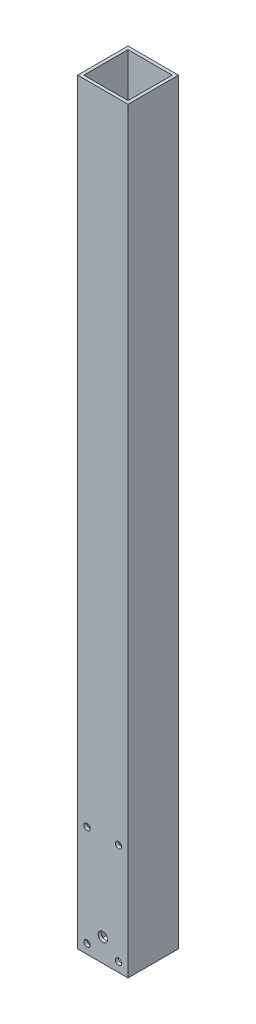
ISO-10303-21;
HEADER;
FILE_DESCRIPTION(('STEP AP214'),'2;1');
FILE_NAME('part.step','',(''),(''),'','','');
FILE_SCHEMA(('AUTOMOTIVE_DESIGN { 1 0 10303 214 1 1 1 1 }'));
ENDSEC;
DATA;
#1=APPLICATION_CONTEXT('core data for automotive mechanical design processes');
#2=APPLICATION_PROTOCOL_DEFINITION('international standard','automotive_design',2000,#1);
#3=PRODUCT_CONTEXT('',#1,'mechanical');
#4=PRODUCT('Part','Part','',(#3));
#5=PRODUCT_RELATED_PRODUCT_CATEGORY('part','',(#4));
#6=PRODUCT_DEFINITION_FORMATION('','',#4);
#7=PRODUCT_DEFINITION_CONTEXT('part definition',#1,'design');
#8=PRODUCT_DEFINITION('design','',#6,#7);
#9=PRODUCT_DEFINITION_SHAPE('','',#8);
#10=(LENGTH_UNIT() NAMED_UNIT(*) SI_UNIT(.MILLI.,.METRE.));
#11=(NAMED_UNIT(*) PLANE_ANGLE_UNIT() SI_UNIT($,.RADIAN.));
#12=(NAMED_UNIT(*) SI_UNIT($,.STERADIAN.) SOLID_ANGLE_UNIT());
#13=UNCERTAINTY_MEASURE_WITH_UNIT(LENGTH_MEASURE(1.E-05),#10,'distance_accuracy_value','');
#14=(GEOMETRIC_REPRESENTATION_CONTEXT(3) GLOBAL_UNCERTAINTY_ASSIGNED_CONTEXT((#13)) GLOBAL_UNIT_ASSIGNED_CONTEXT((#10,
#11,#12)) REPRESENTATION_CONTEXT('',''));
#15=CARTESIAN_POINT('',(0.,0.,0.));
#16=DIRECTION('',(0.,0.,1.));
#17=DIRECTION('',(1.,0.,0.));
#18=AXIS2_PLACEMENT_3D('',#15,#16,#17);
#19=CARTESIAN_POINT('',(0.,762.,0.));
#20=DIRECTION('',(0.,-1.,0.));
#21=DIRECTION('',(0.,0.,-1.));
#22=AXIS2_PLACEMENT_3D('',#19,#20,#21);
#23=PLANE('',#22);
#24=DIRECTION('',(0.,0.,1.));
#25=VECTOR('',#24,1.);
#26=CARTESIAN_POINT('',(0.,762.,0.));
#27=LINE('',#26,#25);
#28=CARTESIAN_POINT('',(0.,762.,-50.8));
#29=VERTEX_POINT('',#28);
#30=CARTESIAN_POINT('',(0.,762.,0.));
#31=VERTEX_POINT('',#30);
#32=EDGE_CURVE('E139',#29,#31,#27,.T.);
#33=ORIENTED_EDGE('',*,*,#32,.T.);
#34=DIRECTION('',(1.,0.,0.));
#35=VECTOR('',#34,1.);
#36=CARTESIAN_POINT('',(0.,762.,0.));
#37=LINE('',#36,#35);
#38=CARTESIAN_POINT('',(50.8,762.,0.));
#39=VERTEX_POINT('',#38);
#40=EDGE_CURVE('E142',#31,#39,#37,.T.);
#41=ORIENTED_EDGE('',*,*,#40,.T.);
#42=DIRECTION('',(0.,0.,-1.));
#43=VECTOR('',#42,1.);
#44=CARTESIAN_POINT('',(50.8,762.,0.));
#45=LINE('',#44,#43);
#46=CARTESIAN_POINT('',(50.8,762.,-50.8));
#47=VERTEX_POINT('',#46);
#48=EDGE_CURVE('E145',#39,#47,#45,.T.);
#49=ORIENTED_EDGE('',*,*,#48,.T.);
#50=DIRECTION('',(-1.,0.,0.));
#51=VECTOR('',#50,1.);
#52=CARTESIAN_POINT('',(0.,762.,-50.8));
#53=LINE('',#52,#51);
#54=EDGE_CURVE('E147',#47,#29,#53,.T.);
#55=ORIENTED_EDGE('',*,*,#54,.T.);
#56=EDGE_LOOP('',(#33,#41,#49,#55));
#57=FACE_BOUND('',#56,.T.);
#58=DIRECTION('',(0.,0.,1.));
#59=VECTOR('',#58,1.);
#60=CARTESIAN_POINT('',(3.175,762.,-3.175));
#61=LINE('',#60,#59);
#62=CARTESIAN_POINT('',(3.175,762.,-47.625));
#63=VERTEX_POINT('',#62);
#64=CARTESIAN_POINT('',(3.175,762.,-3.175));
#65=VERTEX_POINT('',#64);
#66=EDGE_CURVE('E101',#63,#65,#61,.T.);
#67=ORIENTED_EDGE('',*,*,#66,.F.);
#68=DIRECTION('',(-1.,0.,0.));
#69=VECTOR('',#68,1.);
#70=CARTESIAN_POINT('',(3.175,762.,-47.625));
#71=LINE('',#70,#69);
#72=CARTESIAN_POINT('',(47.625,762.,-47.625));
#73=VERTEX_POINT('',#72);
#74=EDGE_CURVE('E123',#73,#63,#71,.T.);
#75=ORIENTED_EDGE('',*,*,#74,.F.);
#76=DIRECTION('',(0.,0.,-1.));
#77=VECTOR('',#76,1.);
#78=CARTESIAN_POINT('',(47.625,762.,-3.175));
#79=LINE('',#78,#77);
#80=CARTESIAN_POINT('',(47.625,762.,-3.175));
#81=VERTEX_POINT('',#80);
#82=EDGE_CURVE('E121',#81,#73,#79,.T.);
#83=ORIENTED_EDGE('',*,*,#82,.F.);
#84=DIRECTION('',(1.,0.,0.));
#85=VECTOR('',#84,1.);
#86=CARTESIAN_POINT('',(3.175,762.,-3.175));
#87=LINE('',#86,#85);
#88=EDGE_CURVE('E109',#65,#81,#87,.T.);
#89=ORIENTED_EDGE('',*,*,#88,.F.);
#90=EDGE_LOOP('',(#67,#75,#83,#89));
#91=FACE_BOUND('',#90,.T.);
#92=ADVANCED_FACE('F34',(#57,#91),#23,.F.);
#93=CARTESIAN_POINT('',(0.,0.,0.));
#94=DIRECTION('',(0.,-1.,0.));
#95=DIRECTION('',(0.,0.,-1.));
#96=AXIS2_PLACEMENT_3D('',#93,#94,#95);
#97=PLANE('',#96);
#98=DIRECTION('',(0.,0.,1.));
#99=VECTOR('',#98,1.);
#100=CARTESIAN_POINT('',(0.,0.,0.));
#101=LINE('',#100,#99);
#102=CARTESIAN_POINT('',(0.,0.,-50.8));
#103=VERTEX_POINT('',#102);
#104=CARTESIAN_POINT('',(0.,0.,0.));
#105=VERTEX_POINT('',#104);
#106=EDGE_CURVE('E117',#103,#105,#101,.T.);
#107=ORIENTED_EDGE('',*,*,#106,.F.);
#108=DIRECTION('',(-1.,0.,0.));
#109=VECTOR('',#108,1.);
#110=CARTESIAN_POINT('',(0.,0.,-50.8));
#111=LINE('',#110,#109);
#112=CARTESIAN_POINT('',(50.8,0.,-50.8));
#113=VERTEX_POINT('',#112);
#114=EDGE_CURVE('E143',#113,#103,#111,.T.);
#115=ORIENTED_EDGE('',*,*,#114,.F.);
#116=DIRECTION('',(0.,0.,-1.));
#117=VECTOR('',#116,1.);
#118=CARTESIAN_POINT('',(50.8,0.,0.));
#119=LINE('',#118,#117);
#120=CARTESIAN_POINT('',(50.8,0.,0.));
#121=VERTEX_POINT('',#120);
#122=EDGE_CURVE('E154',#121,#113,#119,.T.);
#123=ORIENTED_EDGE('',*,*,#122,.F.);
#124=DIRECTION('',(1.,0.,0.));
#125=VECTOR('',#124,1.);
#126=CARTESIAN_POINT('',(0.,0.,0.));
#127=LINE('',#126,#125);
#128=EDGE_CURVE('E152',#105,#121,#127,.T.);
#129=ORIENTED_EDGE('',*,*,#128,.F.);
#130=EDGE_LOOP('',(#107,#115,#123,#129));
#131=FACE_BOUND('',#130,.T.);
#132=DIRECTION('',(-1.,0.,0.));
#133=VECTOR('',#132,1.);
#134=CARTESIAN_POINT('',(3.175,0.,-47.625));
#135=LINE('',#134,#133);
#136=CARTESIAN_POINT('',(47.625,0.,-47.625));
#137=VERTEX_POINT('',#136);
#138=CARTESIAN_POINT('',(3.175,0.,-47.625));
#139=VERTEX_POINT('',#138);
#140=EDGE_CURVE('E110',#137,#139,#135,.T.);
#141=ORIENTED_EDGE('',*,*,#140,.T.);
#142=DIRECTION('',(0.,0.,1.));
#143=VECTOR('',#142,1.);
#144=CARTESIAN_POINT('',(3.175,0.,-3.175));
#145=LINE('',#144,#143);
#146=CARTESIAN_POINT('',(3.175,0.,-3.175));
#147=VERTEX_POINT('',#146);
#148=EDGE_CURVE('E59',#139,#147,#145,.T.);
#149=ORIENTED_EDGE('',*,*,#148,.T.);
#150=DIRECTION('',(1.,0.,0.));
#151=VECTOR('',#150,1.);
#152=CARTESIAN_POINT('',(3.175,0.,-3.175));
#153=LINE('',#152,#151);
#154=CARTESIAN_POINT('',(47.625,0.,-3.175));
#155=VERTEX_POINT('',#154);
#156=EDGE_CURVE('E116',#147,#155,#153,.T.);
#157=ORIENTED_EDGE('',*,*,#156,.T.);
#158=DIRECTION('',(0.,0.,-1.));
#159=VECTOR('',#158,1.);
#160=CARTESIAN_POINT('',(47.625,0.,-3.175));
#161=LINE('',#160,#159);
#162=EDGE_CURVE('E131',#155,#137,#161,.T.);
#163=ORIENTED_EDGE('',*,*,#162,.T.);
#164=EDGE_LOOP('',(#141,#149,#157,#163));
#165=FACE_BOUND('',#164,.T.);
#166=ADVANCED_FACE('F212',(#131,#165),#97,.T.);
#167=CARTESIAN_POINT('',(0.,762.,0.));
#168=DIRECTION('',(1.,0.,0.));
#169=DIRECTION('',(0.,0.,-1.));
#170=AXIS2_PLACEMENT_3D('',#167,#168,#169);
#171=PLANE('',#170);
#172=ORIENTED_EDGE('',*,*,#106,.T.);
#173=DIRECTION('',(0.,-1.,0.));
#174=VECTOR('',#173,1.);
#175=CARTESIAN_POINT('',(0.,762.,0.));
#176=LINE('',#175,#174);
#177=EDGE_CURVE('E11',#31,#105,#176,.T.);
#178=ORIENTED_EDGE('',*,*,#177,.F.);
#179=ORIENTED_EDGE('',*,*,#32,.F.);
#180=DIRECTION('',(0.,-1.,0.));
#181=VECTOR('',#180,1.);
#182=CARTESIAN_POINT('',(0.,762.,-50.8));
#183=LINE('',#182,#181);
#184=EDGE_CURVE('E149',#29,#103,#183,.T.);
#185=ORIENTED_EDGE('',*,*,#184,.T.);
#186=EDGE_LOOP('',(#172,#178,#179,#185));
#187=FACE_BOUND('',#186,.T.);
#188=ADVANCED_FACE('F36',(#187),#171,.F.);
#189=CARTESIAN_POINT('',(0.,762.,0.));
#190=DIRECTION('',(0.,0.,-1.));
#191=DIRECTION('',(-1.,0.,0.));
#192=AXIS2_PLACEMENT_3D('',#189,#190,#191);
#193=PLANE('',#192);
#194=CARTESIAN_POINT('',(41.275,111.125,0.));
#195=DIRECTION('',(0.,0.,1.));
#196=DIRECTION('',(1.,0.,0.));
#197=AXIS2_PLACEMENT_3D('',#194,#195,#196);
#198=CIRCLE('',#197,3.175);
#199=CARTESIAN_POINT('',(44.45,111.125,0.));
#200=VERTEX_POINT('',#199);
#201=EDGE_CURVE('E248',#200,#200,#198,.T.);
#202=ORIENTED_EDGE('',*,*,#201,.F.);
#203=EDGE_LOOP('',(#202));
#204=FACE_BOUND('',#203,.T.);
#205=CARTESIAN_POINT('',(9.525,9.525,0.));
#206=DIRECTION('',(0.,0.,1.));
#207=DIRECTION('',(1.,0.,0.));
#208=AXIS2_PLACEMENT_3D('',#205,#206,#207);
#209=CIRCLE('',#208,3.175);
#210=CARTESIAN_POINT('',(12.7,9.525,0.));
#211=VERTEX_POINT('',#210);
#212=EDGE_CURVE('E252',#211,#211,#209,.T.);
#213=ORIENTED_EDGE('',*,*,#212,.F.);
#214=EDGE_LOOP('',(#213));
#215=FACE_BOUND('',#214,.T.);
#216=CARTESIAN_POINT('',(41.275,9.525,0.));
#217=DIRECTION('',(0.,0.,1.));
#218=DIRECTION('',(1.,0.,0.));
#219=AXIS2_PLACEMENT_3D('',#216,#217,#218);
#220=CIRCLE('',#219,3.175);
#221=CARTESIAN_POINT('',(44.45,9.525,0.));
#222=VERTEX_POINT('',#221);
#223=EDGE_CURVE('E256',#222,#222,#220,.T.);
#224=ORIENTED_EDGE('',*,*,#223,.F.);
#225=EDGE_LOOP('',(#224));
#226=FACE_BOUND('',#225,.T.);
#227=CARTESIAN_POINT('',(25.4,23.114,0.));
#228=DIRECTION('',(0.,0.,1.));
#229=DIRECTION('',(1.,0.,0.));
#230=AXIS2_PLACEMENT_3D('',#227,#228,#229);
#231=CIRCLE('',#230,4.7625);
#232=CARTESIAN_POINT('',(30.1625,23.114,0.));
#233=VERTEX_POINT('',#232);
#234=EDGE_CURVE('E260',#233,#233,#231,.T.);
#235=ORIENTED_EDGE('',*,*,#234,.F.);
#236=EDGE_LOOP('',(#235));
#237=FACE_BOUND('',#236,.T.);
#238=CARTESIAN_POINT('',(9.525,111.125,0.));
#239=DIRECTION('',(0.,0.,1.));
#240=DIRECTION('',(1.,0.,0.));
#241=AXIS2_PLACEMENT_3D('',#238,#239,#240);
#242=CIRCLE('',#241,3.175);
#243=CARTESIAN_POINT('',(12.7,111.125,0.));
#244=VERTEX_POINT('',#243);
#245=EDGE_CURVE('E264',#244,#244,#242,.T.);
#246=ORIENTED_EDGE('',*,*,#245,.F.);
#247=EDGE_LOOP('',(#246));
#248=FACE_BOUND('',#247,.T.);
#249=ORIENTED_EDGE('',*,*,#128,.T.);
#250=DIRECTION('',(0.,-1.,0.));
#251=VECTOR('',#250,1.);
#252=CARTESIAN_POINT('',(50.8,762.,0.));
#253=LINE('',#252,#251);
#254=EDGE_CURVE('E43',#39,#121,#253,.T.);
#255=ORIENTED_EDGE('',*,*,#254,.F.);
#256=ORIENTED_EDGE('',*,*,#40,.F.);
#257=ORIENTED_EDGE('',*,*,#177,.T.);
#258=EDGE_LOOP('',(#249,#255,#256,#257));
#259=FACE_BOUND('',#258,.T.);
#260=ADVANCED_FACE('F237',(#204,#215,#226,#237,#248,#259),#193,.F.);
#261=CARTESIAN_POINT('',(50.8,762.,0.));
#262=DIRECTION('',(-1.,0.,0.));
#263=DIRECTION('',(0.,0.,1.));
#264=AXIS2_PLACEMENT_3D('',#261,#262,#263);
#265=PLANE('',#264);
#266=ORIENTED_EDGE('',*,*,#122,.T.);
#267=DIRECTION('',(0.,-1.,0.));
#268=VECTOR('',#267,1.);
#269=CARTESIAN_POINT('',(50.8,762.,-50.8));
#270=LINE('',#269,#268);
#271=EDGE_CURVE('E159',#47,#113,#270,.T.);
#272=ORIENTED_EDGE('',*,*,#271,.F.);
#273=ORIENTED_EDGE('',*,*,#48,.F.);
#274=ORIENTED_EDGE('',*,*,#254,.T.);
#275=EDGE_LOOP('',(#266,#272,#273,#274));
#276=FACE_BOUND('',#275,.T.);
#277=ADVANCED_FACE('F234',(#276),#265,.F.);
#278=CARTESIAN_POINT('',(0.,762.,-50.8));
#279=DIRECTION('',(0.,0.,1.));
#280=DIRECTION('',(1.,0.,0.));
#281=AXIS2_PLACEMENT_3D('',#278,#279,#280);
#282=PLANE('',#281);
#283=CARTESIAN_POINT('',(41.275,111.125,-50.8));
#284=DIRECTION('',(0.,0.,1.));
#285=DIRECTION('',(1.,0.,0.));
#286=AXIS2_PLACEMENT_3D('',#283,#284,#285);
#287=CIRCLE('',#286,3.175);
#288=CARTESIAN_POINT('',(44.45,111.125,-50.8));
#289=VERTEX_POINT('',#288);
#290=EDGE_CURVE('E277',#289,#289,#287,.T.);
#291=ORIENTED_EDGE('',*,*,#290,.T.);
#292=EDGE_LOOP('',(#291));
#293=FACE_BOUND('',#292,.T.);
#294=CARTESIAN_POINT('',(9.525,9.525,-50.8));
#295=DIRECTION('',(0.,0.,1.));
#296=DIRECTION('',(1.,0.,0.));
#297=AXIS2_PLACEMENT_3D('',#294,#295,#296);
#298=CIRCLE('',#297,3.175);
#299=CARTESIAN_POINT('',(12.7,9.525,-50.8));
#300=VERTEX_POINT('',#299);
#301=EDGE_CURVE('E333',#300,#300,#298,.T.);
#302=ORIENTED_EDGE('',*,*,#301,.T.);
#303=EDGE_LOOP('',(#302));
#304=FACE_BOUND('',#303,.T.);
#305=CARTESIAN_POINT('',(41.275,9.525,-50.8));
#306=DIRECTION('',(0.,0.,1.));
#307=DIRECTION('',(1.,0.,0.));
#308=AXIS2_PLACEMENT_3D('',#305,#306,#307);
#309=CIRCLE('',#308,3.175);
#310=CARTESIAN_POINT('',(44.45,9.525,-50.8));
#311=VERTEX_POINT('',#310);
#312=EDGE_CURVE('E334',#311,#311,#309,.T.);
#313=ORIENTED_EDGE('',*,*,#312,.T.);
#314=EDGE_LOOP('',(#313));
#315=FACE_BOUND('',#314,.T.);
#316=CARTESIAN_POINT('',(25.4,23.114,-50.8));
#317=DIRECTION('',(0.,0.,1.));
#318=DIRECTION('',(1.,0.,0.));
#319=AXIS2_PLACEMENT_3D('',#316,#317,#318);
#320=CIRCLE('',#319,4.7625);
#321=CARTESIAN_POINT('',(30.1625,23.114,-50.8));
#322=VERTEX_POINT('',#321);
#323=EDGE_CURVE('E342',#322,#322,#320,.T.);
#324=ORIENTED_EDGE('',*,*,#323,.T.);
#325=EDGE_LOOP('',(#324));
#326=FACE_BOUND('',#325,.T.);
#327=CARTESIAN_POINT('',(9.525,111.125,-50.8));
#328=DIRECTION('',(0.,0.,1.));
#329=DIRECTION('',(1.,0.,0.));
#330=AXIS2_PLACEMENT_3D('',#327,#328,#329);
#331=CIRCLE('',#330,3.175);
#332=CARTESIAN_POINT('',(12.7,111.125,-50.8));
#333=VERTEX_POINT('',#332);
#334=EDGE_CURVE('E168',#333,#333,#331,.T.);
#335=ORIENTED_EDGE('',*,*,#334,.T.);
#336=EDGE_LOOP('',(#335));
#337=FACE_BOUND('',#336,.T.);
#338=ORIENTED_EDGE('',*,*,#114,.T.);
#339=ORIENTED_EDGE('',*,*,#184,.F.);
#340=ORIENTED_EDGE('',*,*,#54,.F.);
#341=ORIENTED_EDGE('',*,*,#271,.T.);
#342=EDGE_LOOP('',(#338,#339,#340,#341));
#343=FACE_BOUND('',#342,.T.);
#344=ADVANCED_FACE('F231',(#293,#304,#315,#326,#337,#343),#282,.F.);
#345=CARTESIAN_POINT('',(3.175,762.,-3.175));
#346=DIRECTION('',(1.,0.,0.));
#347=DIRECTION('',(0.,0.,-1.));
#348=AXIS2_PLACEMENT_3D('',#345,#346,#347);
#349=PLANE('',#348);
#350=ORIENTED_EDGE('',*,*,#148,.F.);
#351=DIRECTION('',(0.,-1.,0.));
#352=VECTOR('',#351,1.);
#353=CARTESIAN_POINT('',(3.175,762.,-47.625));
#354=LINE('',#353,#352);
#355=EDGE_CURVE('E105',#63,#139,#354,.T.);
#356=ORIENTED_EDGE('',*,*,#355,.F.);
#357=ORIENTED_EDGE('',*,*,#66,.T.);
#358=DIRECTION('',(0.,-1.,0.));
#359=VECTOR('',#358,1.);
#360=CARTESIAN_POINT('',(3.175,762.,-3.175));
#361=LINE('',#360,#359);
#362=EDGE_CURVE('E104',#65,#147,#361,.T.);
#363=ORIENTED_EDGE('',*,*,#362,.T.);
#364=EDGE_LOOP('',(#350,#356,#357,#363));
#365=FACE_BOUND('',#364,.T.);
#366=ADVANCED_FACE('F103',(#365),#349,.T.);
#367=CARTESIAN_POINT('',(3.175,762.,-3.175));
#368=DIRECTION('',(0.,0.,-1.));
#369=DIRECTION('',(-1.,0.,0.));
#370=AXIS2_PLACEMENT_3D('',#367,#368,#369);
#371=PLANE('',#370);
#372=CARTESIAN_POINT('',(41.275,111.125,-3.175));
#373=DIRECTION('',(0.,0.,-1.));
#374=DIRECTION('',(-1.,0.,0.));
#375=AXIS2_PLACEMENT_3D('',#372,#373,#374);
#376=CIRCLE('',#375,3.175);
#377=CARTESIAN_POINT('',(38.1,111.125,-3.175));
#378=VERTEX_POINT('',#377);
#379=EDGE_CURVE('E129',#378,#378,#376,.T.);
#380=ORIENTED_EDGE('',*,*,#379,.F.);
#381=EDGE_LOOP('',(#380));
#382=FACE_BOUND('',#381,.T.);
#383=CARTESIAN_POINT('',(9.525,9.525,-3.175));
#384=DIRECTION('',(0.,0.,-1.));
#385=DIRECTION('',(-1.,0.,0.));
#386=AXIS2_PLACEMENT_3D('',#383,#384,#385);
#387=CIRCLE('',#386,3.175);
#388=CARTESIAN_POINT('',(6.35,9.525,-3.175));
#389=VERTEX_POINT('',#388);
#390=EDGE_CURVE('E178',#389,#389,#387,.T.);
#391=ORIENTED_EDGE('',*,*,#390,.F.);
#392=EDGE_LOOP('',(#391));
#393=FACE_BOUND('',#392,.T.);
#394=CARTESIAN_POINT('',(41.275,9.525,-3.175));
#395=DIRECTION('',(0.,0.,-1.));
#396=DIRECTION('',(-1.,0.,0.));
#397=AXIS2_PLACEMENT_3D('',#394,#395,#396);
#398=CIRCLE('',#397,3.175);
#399=CARTESIAN_POINT('',(38.1,9.525,-3.175));
#400=VERTEX_POINT('',#399);
#401=EDGE_CURVE('E175',#400,#400,#398,.T.);
#402=ORIENTED_EDGE('',*,*,#401,.F.);
#403=EDGE_LOOP('',(#402));
#404=FACE_BOUND('',#403,.T.);
#405=CARTESIAN_POINT('',(25.4,23.114,-3.175));
#406=DIRECTION('',(0.,0.,-1.));
#407=DIRECTION('',(-1.,0.,0.));
#408=AXIS2_PLACEMENT_3D('',#405,#406,#407);
#409=CIRCLE('',#408,4.7625);
#410=CARTESIAN_POINT('',(20.6375,23.114,-3.175));
#411=VERTEX_POINT('',#410);
#412=EDGE_CURVE('E172',#411,#411,#409,.T.);
#413=ORIENTED_EDGE('',*,*,#412,.F.);
#414=EDGE_LOOP('',(#413));
#415=FACE_BOUND('',#414,.T.);
#416=CARTESIAN_POINT('',(9.525,111.125,-3.175));
#417=DIRECTION('',(0.,0.,-1.));
#418=DIRECTION('',(-1.,0.,0.));
#419=AXIS2_PLACEMENT_3D('',#416,#417,#418);
#420=CIRCLE('',#419,3.175);
#421=CARTESIAN_POINT('',(6.35,111.125,-3.175));
#422=VERTEX_POINT('',#421);
#423=EDGE_CURVE('E167',#422,#422,#420,.T.);
#424=ORIENTED_EDGE('',*,*,#423,.F.);
#425=EDGE_LOOP('',(#424));
#426=FACE_BOUND('',#425,.T.);
#427=ORIENTED_EDGE('',*,*,#156,.F.);
#428=ORIENTED_EDGE('',*,*,#362,.F.);
#429=ORIENTED_EDGE('',*,*,#88,.T.);
#430=DIRECTION('',(0.,-1.,0.));
#431=VECTOR('',#430,1.);
#432=CARTESIAN_POINT('',(47.625,762.,-3.175));
#433=LINE('',#432,#431);
#434=EDGE_CURVE('E118',#81,#155,#433,.T.);
#435=ORIENTED_EDGE('',*,*,#434,.T.);
#436=EDGE_LOOP('',(#427,#428,#429,#435));
#437=FACE_BOUND('',#436,.T.);
#438=ADVANCED_FACE('F113',(#382,#393,#404,#415,#426,#437),#371,.T.);
#439=CARTESIAN_POINT('',(47.625,762.,-3.175));
#440=DIRECTION('',(-1.,0.,0.));
#441=DIRECTION('',(0.,0.,1.));
#442=AXIS2_PLACEMENT_3D('',#439,#440,#441);
#443=PLANE('',#442);
#444=ORIENTED_EDGE('',*,*,#162,.F.);
#445=ORIENTED_EDGE('',*,*,#434,.F.);
#446=ORIENTED_EDGE('',*,*,#82,.T.);
#447=DIRECTION('',(0.,-1.,0.));
#448=VECTOR('',#447,1.);
#449=CARTESIAN_POINT('',(47.625,762.,-47.625));
#450=LINE('',#449,#448);
#451=EDGE_CURVE('E51',#73,#137,#450,.T.);
#452=ORIENTED_EDGE('',*,*,#451,.T.);
#453=EDGE_LOOP('',(#444,#445,#446,#452));
#454=FACE_BOUND('',#453,.T.);
#455=ADVANCED_FACE('F202',(#454),#443,.T.);
#456=CARTESIAN_POINT('',(3.175,762.,-47.625));
#457=DIRECTION('',(0.,0.,1.));
#458=DIRECTION('',(1.,0.,0.));
#459=AXIS2_PLACEMENT_3D('',#456,#457,#458);
#460=PLANE('',#459);
#461=CARTESIAN_POINT('',(41.275,111.125,-47.625));
#462=DIRECTION('',(0.,0.,1.));
#463=DIRECTION('',(1.,0.,0.));
#464=AXIS2_PLACEMENT_3D('',#461,#462,#463);
#465=CIRCLE('',#464,3.175);
#466=CARTESIAN_POINT('',(44.45,111.125,-47.625));
#467=VERTEX_POINT('',#466);
#468=EDGE_CURVE('E38',#467,#467,#465,.T.);
#469=ORIENTED_EDGE('',*,*,#468,.F.);
#470=EDGE_LOOP('',(#469));
#471=FACE_BOUND('',#470,.T.);
#472=CARTESIAN_POINT('',(9.525,9.525,-47.625));
#473=DIRECTION('',(0.,0.,1.));
#474=DIRECTION('',(1.,0.,0.));
#475=AXIS2_PLACEMENT_3D('',#472,#473,#474);
#476=CIRCLE('',#475,3.175);
#477=CARTESIAN_POINT('',(12.7,9.525,-47.625));
#478=VERTEX_POINT('',#477);
#479=EDGE_CURVE('E176',#478,#478,#476,.T.);
#480=ORIENTED_EDGE('',*,*,#479,.F.);
#481=EDGE_LOOP('',(#480));
#482=FACE_BOUND('',#481,.T.);
#483=CARTESIAN_POINT('',(41.275,9.525,-47.625));
#484=DIRECTION('',(0.,0.,1.));
#485=DIRECTION('',(1.,0.,0.));
#486=AXIS2_PLACEMENT_3D('',#483,#484,#485);
#487=CIRCLE('',#486,3.175);
#488=CARTESIAN_POINT('',(44.45,9.525,-47.625));
#489=VERTEX_POINT('',#488);
#490=EDGE_CURVE('E173',#489,#489,#487,.T.);
#491=ORIENTED_EDGE('',*,*,#490,.F.);
#492=EDGE_LOOP('',(#491));
#493=FACE_BOUND('',#492,.T.);
#494=CARTESIAN_POINT('',(25.4,23.114,-47.625));
#495=DIRECTION('',(0.,0.,1.));
#496=DIRECTION('',(1.,0.,0.));
#497=AXIS2_PLACEMENT_3D('',#494,#495,#496);
#498=CIRCLE('',#497,4.7625);
#499=CARTESIAN_POINT('',(30.1625,23.114,-47.625));
#500=VERTEX_POINT('',#499);
#501=EDGE_CURVE('E169',#500,#500,#498,.T.);
#502=ORIENTED_EDGE('',*,*,#501,.F.);
#503=EDGE_LOOP('',(#502));
#504=FACE_BOUND('',#503,.T.);
#505=CARTESIAN_POINT('',(9.525,111.125,-47.625));
#506=DIRECTION('',(0.,0.,1.));
#507=DIRECTION('',(1.,0.,0.));
#508=AXIS2_PLACEMENT_3D('',#505,#506,#507);
#509=CIRCLE('',#508,3.175);
#510=CARTESIAN_POINT('',(12.7,111.125,-47.625));
#511=VERTEX_POINT('',#510);
#512=EDGE_CURVE('E164',#511,#511,#509,.T.);
#513=ORIENTED_EDGE('',*,*,#512,.F.);
#514=EDGE_LOOP('',(#513));
#515=FACE_BOUND('',#514,.T.);
#516=ORIENTED_EDGE('',*,*,#140,.F.);
#517=ORIENTED_EDGE('',*,*,#451,.F.);
#518=ORIENTED_EDGE('',*,*,#74,.T.);
#519=ORIENTED_EDGE('',*,*,#355,.T.);
#520=EDGE_LOOP('',(#516,#517,#518,#519));
#521=FACE_BOUND('',#520,.T.);
#522=ADVANCED_FACE('F198',(#471,#482,#493,#504,#515,#521),#460,.T.);
#523=CARTESIAN_POINT('',(9.525,111.125,-50.8));
#524=DIRECTION('',(0.,0.,1.));
#525=DIRECTION('',(1.,0.,0.));
#526=AXIS2_PLACEMENT_3D('',#523,#524,#525);
#527=CYLINDRICAL_SURFACE('',#526,3.175);
#528=ORIENTED_EDGE('',*,*,#512,.T.);
#529=EDGE_LOOP('',(#528));
#530=FACE_BOUND('',#529,.T.);
#531=ORIENTED_EDGE('',*,*,#334,.F.);
#532=EDGE_LOOP('',(#531));
#533=FACE_BOUND('',#532,.T.);
#534=ADVANCED_FACE('F201',(#530,#533),#527,.F.);
#535=CARTESIAN_POINT('',(25.4,23.114,-50.8));
#536=DIRECTION('',(0.,0.,1.));
#537=DIRECTION('',(1.,0.,0.));
#538=AXIS2_PLACEMENT_3D('',#535,#536,#537);
#539=CYLINDRICAL_SURFACE('',#538,4.7625);
#540=ORIENTED_EDGE('',*,*,#501,.T.);
#541=EDGE_LOOP('',(#540));
#542=FACE_BOUND('',#541,.T.);
#543=ORIENTED_EDGE('',*,*,#323,.F.);
#544=EDGE_LOOP('',(#543));
#545=FACE_BOUND('',#544,.T.);
#546=ADVANCED_FACE('F299',(#542,#545),#539,.F.);
#547=CARTESIAN_POINT('',(41.275,9.525,-50.8));
#548=DIRECTION('',(0.,0.,1.));
#549=DIRECTION('',(1.,0.,0.));
#550=AXIS2_PLACEMENT_3D('',#547,#548,#549);
#551=CYLINDRICAL_SURFACE('',#550,3.175);
#552=ORIENTED_EDGE('',*,*,#490,.T.);
#553=EDGE_LOOP('',(#552));
#554=FACE_BOUND('',#553,.T.);
#555=ORIENTED_EDGE('',*,*,#312,.F.);
#556=EDGE_LOOP('',(#555));
#557=FACE_BOUND('',#556,.T.);
#558=ADVANCED_FACE('F309',(#554,#557),#551,.F.);
#559=CARTESIAN_POINT('',(9.525,9.525,-50.8));
#560=DIRECTION('',(0.,0.,1.));
#561=DIRECTION('',(1.,0.,0.));
#562=AXIS2_PLACEMENT_3D('',#559,#560,#561);
#563=CYLINDRICAL_SURFACE('',#562,3.175);
#564=ORIENTED_EDGE('',*,*,#479,.T.);
#565=EDGE_LOOP('',(#564));
#566=FACE_BOUND('',#565,.T.);
#567=ORIENTED_EDGE('',*,*,#301,.F.);
#568=EDGE_LOOP('',(#567));
#569=FACE_BOUND('',#568,.T.);
#570=ADVANCED_FACE('F300',(#566,#569),#563,.F.);
#571=CARTESIAN_POINT('',(41.275,111.125,-50.8));
#572=DIRECTION('',(0.,0.,1.));
#573=DIRECTION('',(1.,0.,0.));
#574=AXIS2_PLACEMENT_3D('',#571,#572,#573);
#575=CYLINDRICAL_SURFACE('',#574,3.175);
#576=ORIENTED_EDGE('',*,*,#468,.T.);
#577=EDGE_LOOP('',(#576));
#578=FACE_BOUND('',#577,.T.);
#579=ORIENTED_EDGE('',*,*,#290,.F.);
#580=EDGE_LOOP('',(#579));
#581=FACE_BOUND('',#580,.T.);
#582=ADVANCED_FACE('F195',(#578,#581),#575,.F.);
#583=ORIENTED_EDGE('',*,*,#423,.T.);
#584=EDGE_LOOP('',(#583));
#585=FACE_BOUND('',#584,.T.);
#586=ORIENTED_EDGE('',*,*,#245,.T.);
#587=EDGE_LOOP('',(#586));
#588=FACE_BOUND('',#587,.T.);
#589=ADVANCED_FACE('F287',(#585,#588),#527,.F.);
#590=ORIENTED_EDGE('',*,*,#412,.T.);
#591=EDGE_LOOP('',(#590));
#592=FACE_BOUND('',#591,.T.);
#593=ORIENTED_EDGE('',*,*,#234,.T.);
#594=EDGE_LOOP('',(#593));
#595=FACE_BOUND('',#594,.T.);
#596=ADVANCED_FACE('F290',(#592,#595),#539,.F.);
#597=ORIENTED_EDGE('',*,*,#401,.T.);
#598=EDGE_LOOP('',(#597));
#599=FACE_BOUND('',#598,.T.);
#600=ORIENTED_EDGE('',*,*,#223,.T.);
#601=EDGE_LOOP('',(#600));
#602=FACE_BOUND('',#601,.T.);
#603=ADVANCED_FACE('F296',(#599,#602),#551,.F.);
#604=ORIENTED_EDGE('',*,*,#390,.T.);
#605=EDGE_LOOP('',(#604));
#606=FACE_BOUND('',#605,.T.);
#607=ORIENTED_EDGE('',*,*,#212,.T.);
#608=EDGE_LOOP('',(#607));
#609=FACE_BOUND('',#608,.T.);
#610=ADVANCED_FACE('F321',(#606,#609),#563,.F.);
#611=ORIENTED_EDGE('',*,*,#379,.T.);
#612=EDGE_LOOP('',(#611));
#613=FACE_BOUND('',#612,.T.);
#614=ORIENTED_EDGE('',*,*,#201,.T.);
#615=EDGE_LOOP('',(#614));
#616=FACE_BOUND('',#615,.T.);
#617=ADVANCED_FACE('F302',(#613,#616),#575,.F.);
#618=CLOSED_SHELL('',(#92,#166,#188,#260,#277,#344,#366,#438,#455,#522,#534,#546,#558,#570,#582,
#589,#596,#603,#610,#617));
#619=MANIFOLD_SOLID_BREP('B2',#618);
#620=ADVANCED_BREP_SHAPE_REPRESENTATION('',(#18,#619),#14);
#621=SHAPE_DEFINITION_REPRESENTATION(#9,#620);
ENDSEC;
END-ISO-10303-21;
